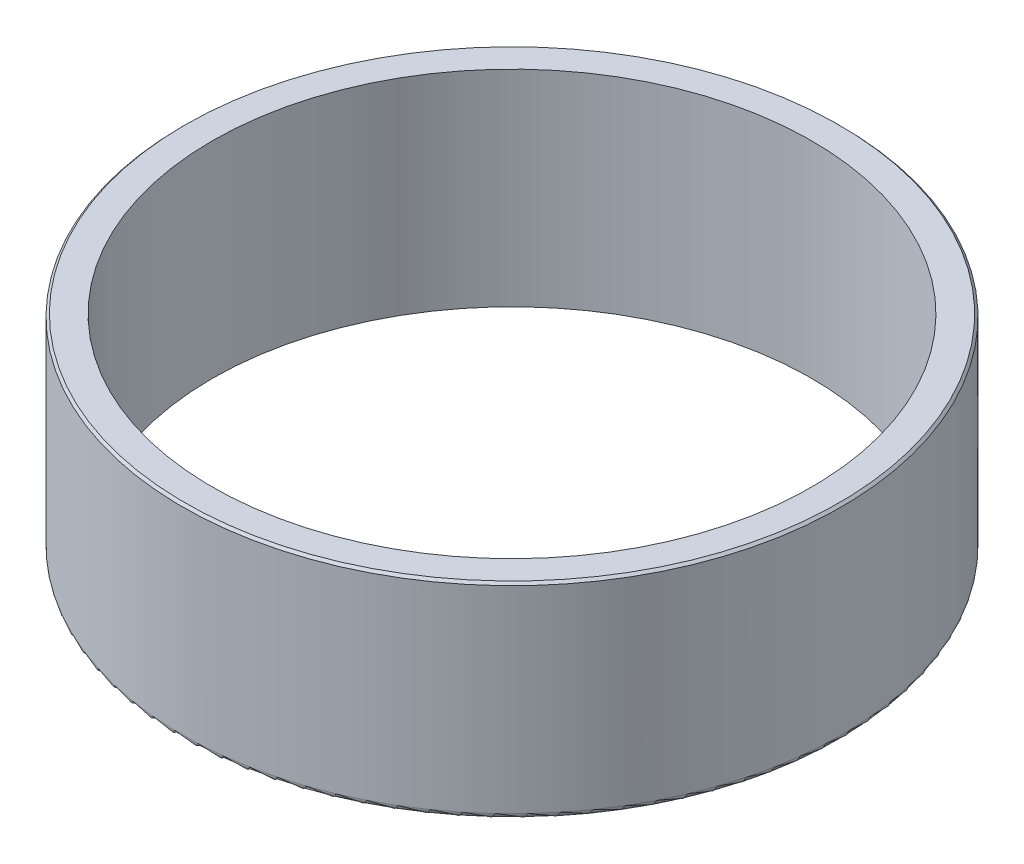
ISO-10303-21;
HEADER;
FILE_DESCRIPTION(('STEP AP214'),'2;1');
FILE_NAME('part.step','',(''),(''),'','','');
FILE_SCHEMA(('AUTOMOTIVE_DESIGN { 1 0 10303 214 1 1 1 1 }'));
ENDSEC;
DATA;
#1=APPLICATION_CONTEXT('core data for automotive mechanical design processes');
#2=APPLICATION_PROTOCOL_DEFINITION('international standard','automotive_design',2000,#1);
#3=PRODUCT_CONTEXT('',#1,'mechanical');
#4=PRODUCT('Part','Part','',(#3));
#5=PRODUCT_RELATED_PRODUCT_CATEGORY('part','',(#4));
#6=PRODUCT_DEFINITION_FORMATION('','',#4);
#7=PRODUCT_DEFINITION_CONTEXT('part definition',#1,'design');
#8=PRODUCT_DEFINITION('design','',#6,#7);
#9=PRODUCT_DEFINITION_SHAPE('','',#8);
#10=(LENGTH_UNIT() NAMED_UNIT(*) SI_UNIT(.MILLI.,.METRE.));
#11=(NAMED_UNIT(*) PLANE_ANGLE_UNIT() SI_UNIT($,.RADIAN.));
#12=(NAMED_UNIT(*) SI_UNIT($,.STERADIAN.) SOLID_ANGLE_UNIT());
#13=UNCERTAINTY_MEASURE_WITH_UNIT(LENGTH_MEASURE(1.E-05),#10,'distance_accuracy_value','');
#14=(GEOMETRIC_REPRESENTATION_CONTEXT(3) GLOBAL_UNCERTAINTY_ASSIGNED_CONTEXT((#13)) GLOBAL_UNIT_ASSIGNED_CONTEXT((#10,
#11,#12)) REPRESENTATION_CONTEXT('',''));
#15=CARTESIAN_POINT('',(0.,0.,0.));
#16=DIRECTION('',(0.,0.,1.));
#17=DIRECTION('',(1.,0.,0.));
#18=AXIS2_PLACEMENT_3D('',#15,#16,#17);
#19=CARTESIAN_POINT('',(-112.216981805476,40.3500000000014,-13.2760511395569));
#20=DIRECTION('',(0.,1.,0.));
#21=DIRECTION('',(1.,0.,0.));
#22=AXIS2_PLACEMENT_3D('',#19,#20,#21);
#23=PLANE('',#22);
#24=CARTESIAN_POINT('',(-112.216981805476,40.3500000000014,-13.2760511395569));
#25=DIRECTION('',(0.,-1.,0.));
#26=DIRECTION('',(1.,0.,0.));
#27=AXIS2_PLACEMENT_3D('',#24,#25,#26);
#28=CIRCLE('',#27,12.6);
#29=CARTESIAN_POINT('',(-124.816981805476,40.3500000000014,-13.2760511395569));
#30=VERTEX_POINT('',#29);
#31=EDGE_CURVE('E20',#30,#30,#28,.T.);
#32=ORIENTED_EDGE('',*,*,#31,.T.);
#33=EDGE_LOOP('',(#32));
#34=FACE_BOUND('',#33,.T.);
#35=CARTESIAN_POINT('',(-112.216981805476,40.3500000000014,-13.2760511395569));
#36=DIRECTION('',(0.,-1.,0.));
#37=DIRECTION('',(1.,0.,0.));
#38=AXIS2_PLACEMENT_3D('',#35,#36,#37);
#39=CIRCLE('',#38,13.75);
#40=CARTESIAN_POINT('',(-125.966981805476,40.3500000000014,-13.2760511395569));
#41=VERTEX_POINT('',#40);
#42=EDGE_CURVE('E26',#41,#41,#39,.T.);
#43=ORIENTED_EDGE('',*,*,#42,.F.);
#44=EDGE_LOOP('',(#43));
#45=FACE_BOUND('',#44,.T.);
#46=ADVANCED_FACE('F16',(#34,#45),#23,.T.);
#47=CARTESIAN_POINT('',(-112.216981805476,40.3000000000014,-13.2760511395569));
#48=DIRECTION('',(0.,-1.,0.));
#49=DIRECTION('',(1.,0.,0.));
#50=AXIS2_PLACEMENT_3D('',#47,#48,#49);
#51=CONICAL_SURFACE('',#50,13.8,0.785398163397448);
#52=ORIENTED_EDGE('',*,*,#42,.T.);
#53=DIRECTION('',(-0.707106781186548,-0.707106781186548,0.));
#54=VECTOR('',#53,1.);
#55=CARTESIAN_POINT('',(-126.016981805476,40.3000000000014,-13.2760511395569));
#56=LINE('',#55,#54);
#57=CARTESIAN_POINT('',(-126.066981805476,40.2500000000014,-13.2760511395569));
#58=VERTEX_POINT('',#57);
#59=EDGE_CURVE('E10',#41,#58,#56,.T.);
#60=ORIENTED_EDGE('',*,*,#59,.T.);
#61=CARTESIAN_POINT('',(-112.216981805476,40.2500000000014,-13.2760511395569));
#62=DIRECTION('',(0.,1.,0.));
#63=DIRECTION('',(1.,0.,0.));
#64=AXIS2_PLACEMENT_3D('',#61,#62,#63);
#65=CIRCLE('',#64,13.85);
#66=EDGE_CURVE('E72',#58,#58,#65,.T.);
#67=ORIENTED_EDGE('',*,*,#66,.T.);
#68=ORIENTED_EDGE('',*,*,#59,.F.);
#69=EDGE_LOOP('',(#52,#60,#67,#68));
#70=FACE_BOUND('',#69,.T.);
#71=ADVANCED_FACE('F18',(#70),#51,.T.);
#72=CARTESIAN_POINT('',(-112.216981805476,31.7000000000014,-13.2760511395569));
#73=DIRECTION('',(0.,1.,0.));
#74=DIRECTION('',(1.,0.,0.));
#75=AXIS2_PLACEMENT_3D('',#72,#73,#74);
#76=CYLINDRICAL_SURFACE('',#75,12.6);
#77=CARTESIAN_POINT('',(-112.216981805476,31.7000000000014,-13.2760511395569));
#78=DIRECTION('',(0.,1.,0.));
#79=DIRECTION('',(1.,0.,0.));
#80=AXIS2_PLACEMENT_3D('',#77,#78,#79);
#81=CIRCLE('',#80,12.6);
#82=CARTESIAN_POINT('',(-124.816981805476,31.7000000000014,-13.2760511395569));
#83=VERTEX_POINT('',#82);
#84=EDGE_CURVE('E74',#83,#83,#81,.T.);
#85=ORIENTED_EDGE('',*,*,#84,.F.);
#86=DIRECTION('',(0.,1.,0.));
#87=VECTOR('',#86,1.);
#88=CARTESIAN_POINT('',(-124.816981805476,31.7000000000014,-13.2760511395569));
#89=LINE('',#88,#87);
#90=EDGE_CURVE('E94',#83,#30,#89,.T.);
#91=ORIENTED_EDGE('',*,*,#90,.T.);
#92=ORIENTED_EDGE('',*,*,#31,.F.);
#93=ORIENTED_EDGE('',*,*,#90,.F.);
#94=EDGE_LOOP('',(#85,#91,#92,#93));
#95=FACE_BOUND('',#94,.T.);
#96=ADVANCED_FACE('F108',(#95),#76,.F.);
#97=CARTESIAN_POINT('',(-112.216981805476,31.7000000000014,-13.2760511395569));
#98=DIRECTION('',(0.,1.,0.));
#99=DIRECTION('',(1.,0.,0.));
#100=AXIS2_PLACEMENT_3D('',#97,#98,#99);
#101=PLANE('',#100);
#102=ORIENTED_EDGE('',*,*,#84,.T.);
#103=EDGE_LOOP('',(#102));
#104=FACE_BOUND('',#103,.T.);
#105=CARTESIAN_POINT('',(-112.216981805476,31.7000000000014,-13.2760511395569));
#106=DIRECTION('',(0.,1.,0.));
#107=DIRECTION('',(1.,0.,0.));
#108=AXIS2_PLACEMENT_3D('',#105,#106,#107);
#109=CIRCLE('',#108,13.6);
#110=CARTESIAN_POINT('',(-112.216981805476,31.7000000000014,-26.8760511395569));
#111=VERTEX_POINT('',#110);
#112=EDGE_CURVE('E83',#111,#111,#109,.T.);
#113=ORIENTED_EDGE('',*,*,#112,.F.);
#114=EDGE_LOOP('',(#113));
#115=FACE_BOUND('',#114,.T.);
#116=ADVANCED_FACE('F105',(#104,#115),#101,.F.);
#117=CARTESIAN_POINT('',(-112.216981805476,31.7000000000014,-13.2760511395569));
#118=DIRECTION('',(0.,1.,0.));
#119=DIRECTION('',(1.,0.,0.));
#120=AXIS2_PLACEMENT_3D('',#117,#118,#119);
#121=CYLINDRICAL_SURFACE('',#120,13.85);
#122=ORIENTED_EDGE('',*,*,#66,.F.);
#123=DIRECTION('',(0.,-1.,0.));
#124=VECTOR('',#123,1.);
#125=CARTESIAN_POINT('',(-126.066981805476,31.7000000000014,-13.2760511395569));
#126=LINE('',#125,#124);
#127=CARTESIAN_POINT('',(-126.066981805476,31.9500000000014,-13.2760511395569));
#128=VERTEX_POINT('',#127);
#129=EDGE_CURVE('E66',#58,#128,#126,.T.);
#130=ORIENTED_EDGE('',*,*,#129,.T.);
#131=CARTESIAN_POINT('',(-112.216981805476,31.9500000000014,-13.2760511395569));
#132=DIRECTION('',(0.,-1.,0.));
#133=DIRECTION('',(1.,0.,0.));
#134=AXIS2_PLACEMENT_3D('',#131,#132,#133);
#135=CIRCLE('',#134,13.85);
#136=CARTESIAN_POINT('',(-112.216981805476,31.9500000000014,-27.1260511395569));
#137=VERTEX_POINT('',#136);
#138=EDGE_CURVE('E70',#137,#128,#135,.T.);
#139=ORIENTED_EDGE('',*,*,#138,.F.);
#140=CARTESIAN_POINT('',(-112.216981805476,31.9500000000014,-13.2760511395569));
#141=DIRECTION('',(0.,-1.,0.));
#142=DIRECTION('',(1.,0.,0.));
#143=AXIS2_PLACEMENT_3D('',#140,#141,#142);
#144=CIRCLE('',#143,13.85);
#145=EDGE_CURVE('E80',#128,#137,#144,.T.);
#146=ORIENTED_EDGE('',*,*,#145,.F.);
#147=ORIENTED_EDGE('',*,*,#129,.F.);
#148=EDGE_LOOP('',(#122,#130,#139,#146,#147));
#149=FACE_BOUND('',#148,.T.);
#150=ADVANCED_FACE('F68',(#149),#121,.T.);
#151=CARTESIAN_POINT('',(-112.216981805476,31.9500000000014,-13.2760511395569));
#152=DIRECTION('',(0.,1.,0.));
#153=DIRECTION('',(0.,0.,1.));
#154=AXIS2_PLACEMENT_3D('',#151,#152,#153);
#155=TOROIDAL_SURFACE('',#154,13.6,0.25);
#156=ORIENTED_EDGE('',*,*,#145,.T.);
#157=CARTESIAN_POINT('',(-112.216981805476,31.9500000000014,-26.8760511395569));
#158=DIRECTION('',(-1.,0.,0.));
#159=DIRECTION('',(0.,0.,-1.));
#160=AXIS2_PLACEMENT_3D('',#157,#158,#159);
#161=CIRCLE('',#160,0.25);
#162=EDGE_CURVE('E81',#137,#111,#161,.T.);
#163=ORIENTED_EDGE('',*,*,#162,.T.);
#164=ORIENTED_EDGE('',*,*,#112,.T.);
#165=ORIENTED_EDGE('',*,*,#162,.F.);
#166=ORIENTED_EDGE('',*,*,#138,.T.);
#167=EDGE_LOOP('',(#156,#163,#164,#165,#166));
#168=FACE_BOUND('',#167,.T.);
#169=ADVANCED_FACE('F78',(#168),#155,.T.);
#170=CLOSED_SHELL('',(#46,#71,#96,#116,#150,#169));
#171=MANIFOLD_SOLID_BREP('B1',#170);
#172=ADVANCED_BREP_SHAPE_REPRESENTATION('',(#18,#171),#14);
#173=SHAPE_DEFINITION_REPRESENTATION(#9,#172);
ENDSEC;
END-ISO-10303-21;
